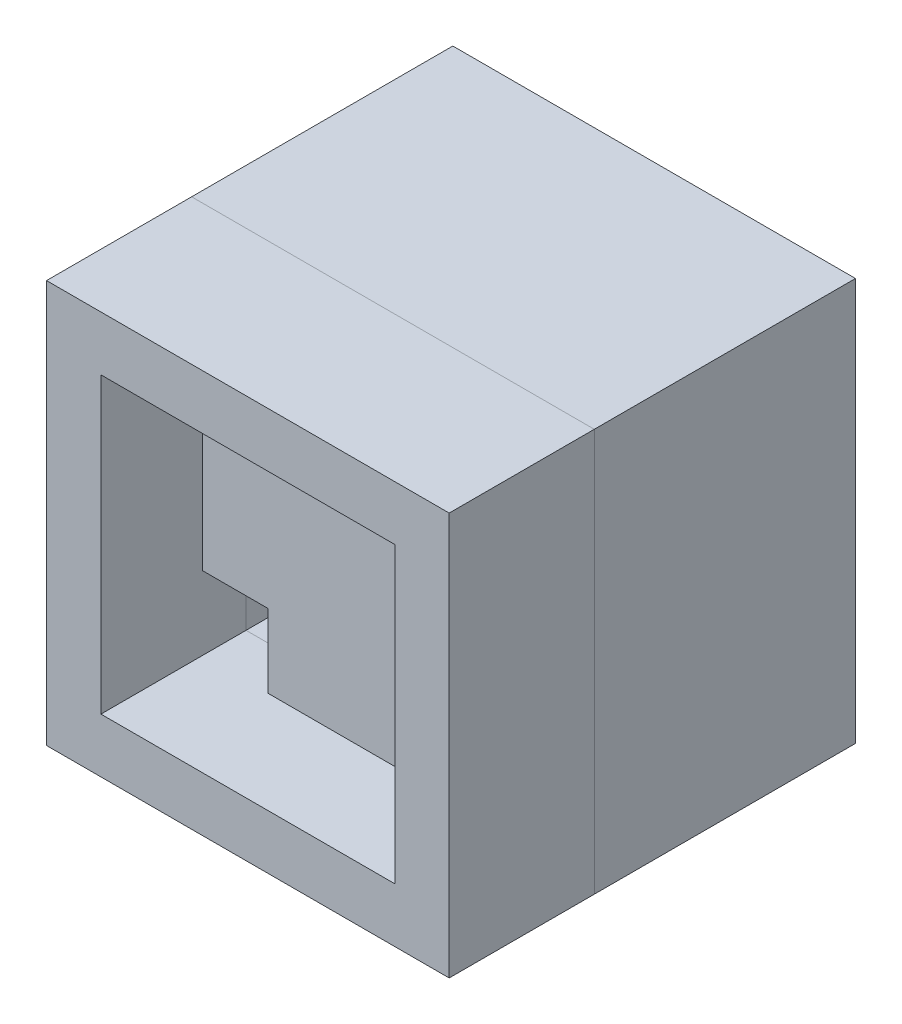
ISO-10303-21;
HEADER;
FILE_DESCRIPTION(('STEP AP214'),'2;1');
FILE_NAME('part.step','',(''),(''),'','','');
FILE_SCHEMA(('AUTOMOTIVE_DESIGN { 1 0 10303 214 1 1 1 1 }'));
ENDSEC;
DATA;
#1=APPLICATION_CONTEXT('core data for automotive mechanical design processes');
#2=APPLICATION_PROTOCOL_DEFINITION('international standard','automotive_design',2000,#1);
#3=PRODUCT_CONTEXT('',#1,'mechanical');
#4=PRODUCT('Part','Part','',(#3));
#5=PRODUCT_RELATED_PRODUCT_CATEGORY('part','',(#4));
#6=PRODUCT_DEFINITION_FORMATION('','',#4);
#7=PRODUCT_DEFINITION_CONTEXT('part definition',#1,'design');
#8=PRODUCT_DEFINITION('design','',#6,#7);
#9=PRODUCT_DEFINITION_SHAPE('','',#8);
#10=(LENGTH_UNIT() NAMED_UNIT(*) SI_UNIT(.MILLI.,.METRE.));
#11=(NAMED_UNIT(*) PLANE_ANGLE_UNIT() SI_UNIT($,.RADIAN.));
#12=(NAMED_UNIT(*) SI_UNIT($,.STERADIAN.) SOLID_ANGLE_UNIT());
#13=UNCERTAINTY_MEASURE_WITH_UNIT(LENGTH_MEASURE(1.E-05),#10,'distance_accuracy_value','');
#14=(GEOMETRIC_REPRESENTATION_CONTEXT(3) GLOBAL_UNCERTAINTY_ASSIGNED_CONTEXT((#13)) GLOBAL_UNIT_ASSIGNED_CONTEXT((#10,
#11,#12)) REPRESENTATION_CONTEXT('',''));
#15=CARTESIAN_POINT('',(0.,0.,0.));
#16=DIRECTION('',(0.,0.,1.));
#17=DIRECTION('',(1.,0.,0.));
#18=AXIS2_PLACEMENT_3D('',#15,#16,#17);
#19=CARTESIAN_POINT('',(7.79999999999714,9.6,7.2));
#20=DIRECTION('',(0.,0.,-1.));
#21=DIRECTION('',(-1.,0.,0.));
#22=AXIS2_PLACEMENT_3D('',#19,#20,#21);
#23=PLANE('',#22);
#24=DIRECTION('',(0.,-1.,0.));
#25=VECTOR('',#24,1.);
#26=CARTESIAN_POINT('',(3.30000000002428,-291588.345,7.2));
#27=LINE('',#26,#25);
#28=CARTESIAN_POINT('',(3.30000000002428,9.59999999997763,7.2));
#29=VERTEX_POINT('',#28);
#30=CARTESIAN_POINT('',(3.30000000002428,7.57499999997435,7.2));
#31=VERTEX_POINT('',#30);
#32=EDGE_CURVE('E300',#29,#31,#27,.T.);
#33=ORIENTED_EDGE('',*,*,#32,.F.);
#34=DIRECTION('',(-1.,0.,0.));
#35=VECTOR('',#34,1.);
#36=CARTESIAN_POINT('',(0.,9.6,7.2));
#37=LINE('',#36,#35);
#38=CARTESIAN_POINT('',(1.5,9.6,7.2));
#39=VERTEX_POINT('',#38);
#40=EDGE_CURVE('E305',#29,#39,#37,.T.);
#41=ORIENTED_EDGE('',*,*,#40,.T.);
#42=DIRECTION('',(0.,-1.,0.));
#43=VECTOR('',#42,1.);
#44=CARTESIAN_POINT('',(1.5,0.,7.2));
#45=LINE('',#44,#43);
#46=CARTESIAN_POINT('',(1.5,7.57499999997435,7.2));
#47=VERTEX_POINT('',#46);
#48=EDGE_CURVE('E448',#39,#47,#45,.T.);
#49=ORIENTED_EDGE('',*,*,#48,.T.);
#50=DIRECTION('',(-1.,0.,0.));
#51=VECTOR('',#50,1.);
#52=CARTESIAN_POINT('',(-399994.45,7.57499999997435,7.2));
#53=LINE('',#52,#51);
#54=EDGE_CURVE('E307',#31,#47,#53,.T.);
#55=ORIENTED_EDGE('',*,*,#54,.F.);
#56=EDGE_LOOP('',(#33,#41,#49,#55));
#57=FACE_BOUND('',#56,.T.);
#58=DIRECTION('',(0.,-1.,0.));
#59=VECTOR('',#58,1.);
#60=CARTESIAN_POINT('',(9.6,0.,7.2));
#61=LINE('',#60,#59);
#62=CARTESIAN_POINT('',(9.6,3.52500000002465,7.2));
#63=VERTEX_POINT('',#62);
#64=CARTESIAN_POINT('',(9.6,1.5,7.2));
#65=VERTEX_POINT('',#64);
#66=EDGE_CURVE('E439',#63,#65,#61,.T.);
#67=ORIENTED_EDGE('',*,*,#66,.F.);
#68=DIRECTION('',(1.,0.,0.));
#69=VECTOR('',#68,1.);
#70=CARTESIAN_POINT('',(-399994.45,3.52500000002465,7.2));
#71=LINE('',#70,#69);
#72=CARTESIAN_POINT('',(7.79999999997472,3.52500000002465,7.2));
#73=VERTEX_POINT('',#72);
#74=EDGE_CURVE('E413',#73,#63,#71,.T.);
#75=ORIENTED_EDGE('',*,*,#74,.F.);
#76=DIRECTION('',(0.,1.,0.));
#77=VECTOR('',#76,1.);
#78=CARTESIAN_POINT('',(7.80000000020209,-291588.345,7.2));
#79=LINE('',#78,#77);
#80=CARTESIAN_POINT('',(7.7999999999523,1.50000000002137,7.2));
#81=VERTEX_POINT('',#80);
#82=EDGE_CURVE('E418',#81,#73,#79,.T.);
#83=ORIENTED_EDGE('',*,*,#82,.F.);
#84=DIRECTION('',(-1.,0.,0.));
#85=VECTOR('',#84,1.);
#86=CARTESIAN_POINT('',(0.,1.5,7.2));
#87=LINE('',#86,#85);
#88=EDGE_CURVE('E446',#65,#81,#87,.T.);
#89=ORIENTED_EDGE('',*,*,#88,.F.);
#90=EDGE_LOOP('',(#67,#75,#83,#89));
#91=FACE_BOUND('',#90,.T.);
#92=CARTESIAN_POINT('',(3.30000000002428,1.5,7.2));
#93=VERTEX_POINT('',#92);
#94=CARTESIAN_POINT('',(1.5,1.5,7.2));
#95=VERTEX_POINT('',#94);
#96=EDGE_CURVE('E445',#93,#95,#87,.T.);
#97=ORIENTED_EDGE('',*,*,#96,.F.);
#98=DIRECTION('',(0.,1.,0.));
#99=VECTOR('',#98,1.);
#100=CARTESIAN_POINT('',(3.30000000002428,-291588.345,7.2));
#101=LINE('',#100,#99);
#102=CARTESIAN_POINT('',(3.30000000002428,3.52500000002465,7.2));
#103=VERTEX_POINT('',#102);
#104=EDGE_CURVE('E393',#93,#103,#101,.T.);
#105=ORIENTED_EDGE('',*,*,#104,.T.);
#106=DIRECTION('',(-1.,0.,0.));
#107=VECTOR('',#106,1.);
#108=CARTESIAN_POINT('',(-399994.45,3.52500000002465,7.2));
#109=LINE('',#108,#107);
#110=CARTESIAN_POINT('',(1.50000000002137,3.52500000002465,7.2));
#111=VERTEX_POINT('',#110);
#112=EDGE_CURVE('E384',#103,#111,#109,.T.);
#113=ORIENTED_EDGE('',*,*,#112,.T.);
#114=EDGE_CURVE('E449',#111,#95,#45,.T.);
#115=ORIENTED_EDGE('',*,*,#114,.T.);
#116=EDGE_LOOP('',(#97,#105,#113,#115));
#117=FACE_BOUND('',#116,.T.);
#118=CARTESIAN_POINT('',(9.6,9.6,7.2));
#119=VERTEX_POINT('',#118);
#120=CARTESIAN_POINT('',(7.79999999999714,9.6,7.2));
#121=VERTEX_POINT('',#120);
#122=EDGE_CURVE('E328',#119,#121,#37,.T.);
#123=ORIENTED_EDGE('',*,*,#122,.T.);
#124=DIRECTION('',(0.,1.,0.));
#125=VECTOR('',#124,1.);
#126=CARTESIAN_POINT('',(7.79999999974734,-291588.345,7.2));
#127=LINE('',#126,#125);
#128=CARTESIAN_POINT('',(7.79999999999714,7.57499999997435,7.2));
#129=VERTEX_POINT('',#128);
#130=EDGE_CURVE('E432',#129,#121,#127,.T.);
#131=ORIENTED_EDGE('',*,*,#130,.F.);
#132=DIRECTION('',(-1.,0.,0.));
#133=VECTOR('',#132,1.);
#134=CARTESIAN_POINT('',(-399994.45,7.57499999997435,7.2));
#135=LINE('',#134,#133);
#136=CARTESIAN_POINT('',(9.59999999997763,7.57499999997435,7.2));
#137=VERTEX_POINT('',#136);
#138=EDGE_CURVE('E428',#137,#129,#135,.T.);
#139=ORIENTED_EDGE('',*,*,#138,.F.);
#140=EDGE_CURVE('E437',#119,#137,#61,.T.);
#141=ORIENTED_EDGE('',*,*,#140,.F.);
#142=EDGE_LOOP('',(#123,#131,#139,#141));
#143=FACE_BOUND('',#142,.T.);
#144=DIRECTION('',(0.,-1.,0.));
#145=VECTOR('',#144,1.);
#146=CARTESIAN_POINT('',(0.,0.,7.2));
#147=LINE('',#146,#145);
#148=CARTESIAN_POINT('',(0.,11.1,7.2));
#149=VERTEX_POINT('',#148);
#150=CARTESIAN_POINT('',(0.,0.,7.2));
#151=VERTEX_POINT('',#150);
#152=EDGE_CURVE('E442',#149,#151,#147,.T.);
#153=ORIENTED_EDGE('',*,*,#152,.F.);
#154=DIRECTION('',(-1.,0.,0.));
#155=VECTOR('',#154,1.);
#156=CARTESIAN_POINT('',(0.,11.1,7.2));
#157=LINE('',#156,#155);
#158=CARTESIAN_POINT('',(11.1,11.1,7.2));
#159=VERTEX_POINT('',#158);
#160=EDGE_CURVE('E440',#159,#149,#157,.T.);
#161=ORIENTED_EDGE('',*,*,#160,.F.);
#162=DIRECTION('',(0.,-1.,0.));
#163=VECTOR('',#162,1.);
#164=CARTESIAN_POINT('',(11.1,0.,7.2));
#165=LINE('',#164,#163);
#166=CARTESIAN_POINT('',(11.1,0.,7.2));
#167=VERTEX_POINT('',#166);
#168=EDGE_CURVE('E331',#159,#167,#165,.T.);
#169=ORIENTED_EDGE('',*,*,#168,.T.);
#170=DIRECTION('',(-1.,0.,0.));
#171=VECTOR('',#170,1.);
#172=CARTESIAN_POINT('',(0.,0.,7.2));
#173=LINE('',#172,#171);
#174=EDGE_CURVE('E451',#167,#151,#173,.T.);
#175=ORIENTED_EDGE('',*,*,#174,.T.);
#176=EDGE_LOOP('',(#153,#161,#169,#175));
#177=FACE_BOUND('',#176,.T.);
#178=ADVANCED_FACE('F164',(#57,#91,#117,#143,#177),#23,.T.);
#179=CARTESIAN_POINT('',(0.,0.,1.2));
#180=DIRECTION('',(0.,1.,0.));
#181=DIRECTION('',(0.,0.,1.));
#182=AXIS2_PLACEMENT_3D('',#179,#180,#181);
#183=PLANE('',#182);
#184=ORIENTED_EDGE('',*,*,#174,.F.);
#185=DIRECTION('',(0.,0.,-1.));
#186=VECTOR('',#185,1.);
#187=CARTESIAN_POINT('',(11.1,0.,1.2));
#188=LINE('',#187,#186);
#189=CARTESIAN_POINT('',(11.1,0.,11.2));
#190=VERTEX_POINT('',#189);
#191=EDGE_CURVE('E337',#190,#167,#188,.T.);
#192=ORIENTED_EDGE('',*,*,#191,.F.);
#193=DIRECTION('',(1.,0.,0.));
#194=VECTOR('',#193,1.);
#195=CARTESIAN_POINT('',(0.,0.,11.2));
#196=LINE('',#195,#194);
#197=CARTESIAN_POINT('',(0.,0.,11.2));
#198=VERTEX_POINT('',#197);
#199=EDGE_CURVE('E346',#198,#190,#196,.T.);
#200=ORIENTED_EDGE('',*,*,#199,.F.);
#201=DIRECTION('',(0.,0.,-1.));
#202=VECTOR('',#201,1.);
#203=CARTESIAN_POINT('',(0.,0.,1.2));
#204=LINE('',#203,#202);
#205=EDGE_CURVE('E335',#198,#151,#204,.T.);
#206=ORIENTED_EDGE('',*,*,#205,.T.);
#207=EDGE_LOOP('',(#184,#192,#200,#206));
#208=FACE_BOUND('',#207,.T.);
#209=ADVANCED_FACE('F522',(#208),#183,.F.);
#210=CARTESIAN_POINT('',(0.,0.,11.2));
#211=DIRECTION('',(0.,0.,-1.));
#212=DIRECTION('',(-1.,0.,0.));
#213=AXIS2_PLACEMENT_3D('',#210,#211,#212);
#214=PLANE('',#213);
#215=DIRECTION('',(0.,1.,0.));
#216=VECTOR('',#215,1.);
#217=CARTESIAN_POINT('',(1.5,0.,11.2));
#218=LINE('',#217,#216);
#219=CARTESIAN_POINT('',(1.5,1.5,11.2));
#220=VERTEX_POINT('',#219);
#221=CARTESIAN_POINT('',(1.5,9.6,11.2));
#222=VERTEX_POINT('',#221);
#223=EDGE_CURVE('E356',#220,#222,#218,.T.);
#224=ORIENTED_EDGE('',*,*,#223,.T.);
#225=DIRECTION('',(1.,0.,0.));
#226=VECTOR('',#225,1.);
#227=CARTESIAN_POINT('',(0.,9.6,11.2));
#228=LINE('',#227,#226);
#229=CARTESIAN_POINT('',(9.6,9.6,11.2));
#230=VERTEX_POINT('',#229);
#231=EDGE_CURVE('E372',#222,#230,#228,.T.);
#232=ORIENTED_EDGE('',*,*,#231,.T.);
#233=DIRECTION('',(0.,1.,0.));
#234=VECTOR('',#233,1.);
#235=CARTESIAN_POINT('',(9.6,0.,11.2));
#236=LINE('',#235,#234);
#237=CARTESIAN_POINT('',(9.6,1.5,11.2));
#238=VERTEX_POINT('',#237);
#239=EDGE_CURVE('E366',#238,#230,#236,.T.);
#240=ORIENTED_EDGE('',*,*,#239,.F.);
#241=DIRECTION('',(1.,0.,0.));
#242=VECTOR('',#241,1.);
#243=CARTESIAN_POINT('',(0.,1.5,11.2));
#244=LINE('',#243,#242);
#245=EDGE_CURVE('E360',#220,#238,#244,.T.);
#246=ORIENTED_EDGE('',*,*,#245,.F.);
#247=EDGE_LOOP('',(#224,#232,#240,#246));
#248=FACE_BOUND('',#247,.T.);
#249=DIRECTION('',(0.,1.,0.));
#250=VECTOR('',#249,1.);
#251=CARTESIAN_POINT('',(0.,0.,11.2));
#252=LINE('',#251,#250);
#253=CARTESIAN_POINT('',(0.,11.1,11.2));
#254=VERTEX_POINT('',#253);
#255=EDGE_CURVE('E349',#198,#254,#252,.T.);
#256=ORIENTED_EDGE('',*,*,#255,.F.);
#257=ORIENTED_EDGE('',*,*,#199,.T.);
#258=DIRECTION('',(0.,1.,0.));
#259=VECTOR('',#258,1.);
#260=CARTESIAN_POINT('',(11.1,0.,11.2));
#261=LINE('',#260,#259);
#262=CARTESIAN_POINT('',(11.1,11.1,11.2));
#263=VERTEX_POINT('',#262);
#264=EDGE_CURVE('E469',#190,#263,#261,.T.);
#265=ORIENTED_EDGE('',*,*,#264,.T.);
#266=DIRECTION('',(1.,0.,0.));
#267=VECTOR('',#266,1.);
#268=CARTESIAN_POINT('',(0.,11.1,11.2));
#269=LINE('',#268,#267);
#270=EDGE_CURVE('E465',#254,#263,#269,.T.);
#271=ORIENTED_EDGE('',*,*,#270,.F.);
#272=EDGE_LOOP('',(#256,#257,#265,#271));
#273=FACE_BOUND('',#272,.T.);
#274=ADVANCED_FACE('F503',(#248,#273),#214,.F.);
#275=CARTESIAN_POINT('',(-399994.45,3.52500000002465,7.2));
#276=DIRECTION('',(0.,1.,0.));
#277=DIRECTION('',(0.,0.,1.));
#278=AXIS2_PLACEMENT_3D('',#275,#276,#277);
#279=PLANE('',#278);
#280=DIRECTION('',(-1.,0.,0.));
#281=VECTOR('',#280,1.);
#282=CARTESIAN_POINT('',(-399994.45,3.52500000002465,8.4));
#283=LINE('',#282,#281);
#284=CARTESIAN_POINT('',(3.30000000002428,3.52500000002465,8.4));
#285=VERTEX_POINT('',#284);
#286=CARTESIAN_POINT('',(1.50000000002137,3.52500000002465,8.4));
#287=VERTEX_POINT('',#286);
#288=EDGE_CURVE('E389',#285,#287,#283,.T.);
#289=ORIENTED_EDGE('',*,*,#288,.T.);
#290=DIRECTION('',(0.,0.,1.));
#291=VECTOR('',#290,1.);
#292=CARTESIAN_POINT('',(1.50000000002137,3.52500000002465,7.2));
#293=LINE('',#292,#291);
#294=EDGE_CURVE('E380',#111,#287,#293,.T.);
#295=ORIENTED_EDGE('',*,*,#294,.F.);
#296=ORIENTED_EDGE('',*,*,#112,.F.);
#297=DIRECTION('',(0.,0.,1.));
#298=VECTOR('',#297,1.);
#299=CARTESIAN_POINT('',(3.30000000002428,3.52500000002465,7.2));
#300=LINE('',#299,#298);
#301=EDGE_CURVE('E385',#103,#285,#300,.T.);
#302=ORIENTED_EDGE('',*,*,#301,.T.);
#303=EDGE_LOOP('',(#289,#295,#296,#302));
#304=FACE_BOUND('',#303,.T.);
#305=ADVANCED_FACE('F530',(#304),#279,.F.);
#306=CARTESIAN_POINT('',(1.5,0.,11.2));
#307=DIRECTION('',(-1.,0.,0.));
#308=DIRECTION('',(0.,-1.,0.));
#309=AXIS2_PLACEMENT_3D('',#306,#307,#308);
#310=PLANE('',#309);
#311=ORIENTED_EDGE('',*,*,#48,.F.);
#312=DIRECTION('',(0.,0.,-1.));
#313=VECTOR('',#312,1.);
#314=CARTESIAN_POINT('',(1.5,9.6,11.2));
#315=LINE('',#314,#313);
#316=EDGE_CURVE('E326',#222,#39,#315,.T.);
#317=ORIENTED_EDGE('',*,*,#316,.F.);
#318=ORIENTED_EDGE('',*,*,#223,.F.);
#319=DIRECTION('',(0.,0.,-1.));
#320=VECTOR('',#319,1.);
#321=CARTESIAN_POINT('',(1.5,1.5,11.2));
#322=LINE('',#321,#320);
#323=EDGE_CURVE('E348',#220,#95,#322,.T.);
#324=ORIENTED_EDGE('',*,*,#323,.T.);
#325=ORIENTED_EDGE('',*,*,#114,.F.);
#326=ORIENTED_EDGE('',*,*,#294,.T.);
#327=DIRECTION('',(0.,-1.,0.));
#328=VECTOR('',#327,1.);
#329=CARTESIAN_POINT('',(1.5,0.,8.4));
#330=LINE('',#329,#328);
#331=CARTESIAN_POINT('',(1.49999999999575,7.57499999997435,8.4));
#332=VERTEX_POINT('',#331);
#333=EDGE_CURVE('E376',#332,#287,#330,.T.);
#334=ORIENTED_EDGE('',*,*,#333,.F.);
#335=DIRECTION('',(0.,0.,1.));
#336=VECTOR('',#335,1.);
#337=CARTESIAN_POINT('',(1.49999999999575,7.57499999997435,7.2));
#338=LINE('',#337,#336);
#339=EDGE_CURVE('E321',#47,#332,#338,.T.);
#340=ORIENTED_EDGE('',*,*,#339,.F.);
#341=EDGE_LOOP('',(#311,#317,#318,#324,#325,#326,#334,#340));
#342=FACE_BOUND('',#341,.T.);
#343=ADVANCED_FACE('F502',(#342),#310,.F.);
#344=CARTESIAN_POINT('',(3.30000000002428,-291588.345,7.2));
#345=DIRECTION('',(-1.,0.,0.));
#346=DIRECTION('',(0.,0.,1.));
#347=AXIS2_PLACEMENT_3D('',#344,#345,#346);
#348=PLANE('',#347);
#349=DIRECTION('',(0.,-1.,0.));
#350=VECTOR('',#349,1.);
#351=CARTESIAN_POINT('',(3.30000000002428,-291588.345,8.4));
#352=LINE('',#351,#350);
#353=CARTESIAN_POINT('',(3.30000000002428,9.59999999997763,8.4));
#354=VERTEX_POINT('',#353);
#355=CARTESIAN_POINT('',(3.30000000002428,7.57499999997435,8.4));
#356=VERTEX_POINT('',#355);
#357=EDGE_CURVE('E318',#354,#356,#352,.T.);
#358=ORIENTED_EDGE('',*,*,#357,.F.);
#359=DIRECTION('',(0.,0.,1.));
#360=VECTOR('',#359,1.);
#361=CARTESIAN_POINT('',(3.30000000002428,9.59999999997763,7.2));
#362=LINE('',#361,#360);
#363=EDGE_CURVE('E315',#29,#354,#362,.T.);
#364=ORIENTED_EDGE('',*,*,#363,.F.);
#365=ORIENTED_EDGE('',*,*,#32,.T.);
#366=DIRECTION('',(0.,0.,1.));
#367=VECTOR('',#366,1.);
#368=CARTESIAN_POINT('',(3.30000000002428,7.57499999997435,7.2));
#369=LINE('',#368,#367);
#370=EDGE_CURVE('E396',#31,#356,#369,.T.);
#371=ORIENTED_EDGE('',*,*,#370,.T.);
#372=EDGE_LOOP('',(#358,#364,#365,#371));
#373=FACE_BOUND('',#372,.T.);
#374=ADVANCED_FACE('F316',(#373),#348,.T.);
#375=CARTESIAN_POINT('',(0.,1.5,11.2));
#376=DIRECTION('',(0.,1.,0.));
#377=DIRECTION('',(-1.,0.,0.));
#378=AXIS2_PLACEMENT_3D('',#375,#376,#377);
#379=PLANE('',#378);
#380=DIRECTION('',(0.,0.,-1.));
#381=VECTOR('',#380,1.);
#382=CARTESIAN_POINT('',(9.6,1.5,11.2));
#383=LINE('',#382,#381);
#384=EDGE_CURVE('E351',#238,#65,#383,.T.);
#385=ORIENTED_EDGE('',*,*,#384,.T.);
#386=ORIENTED_EDGE('',*,*,#88,.T.);
#387=DIRECTION('',(0.,0.,1.));
#388=VECTOR('',#387,1.);
#389=CARTESIAN_POINT('',(7.7999999999523,1.50000000002137,7.2));
#390=LINE('',#389,#388);
#391=CARTESIAN_POINT('',(7.7999999999523,1.5,8.4));
#392=VERTEX_POINT('',#391);
#393=EDGE_CURVE('E405',#81,#392,#390,.T.);
#394=ORIENTED_EDGE('',*,*,#393,.T.);
#395=DIRECTION('',(-1.,0.,0.));
#396=VECTOR('',#395,1.);
#397=CARTESIAN_POINT('',(0.,1.5,8.4));
#398=LINE('',#397,#396);
#399=CARTESIAN_POINT('',(3.30000000002428,1.5,8.4));
#400=VERTEX_POINT('',#399);
#401=EDGE_CURVE('E378',#392,#400,#398,.T.);
#402=ORIENTED_EDGE('',*,*,#401,.T.);
#403=DIRECTION('',(0.,0.,1.));
#404=VECTOR('',#403,1.);
#405=CARTESIAN_POINT('',(3.30000000002428,1.50000000002137,7.2));
#406=LINE('',#405,#404);
#407=EDGE_CURVE('E381',#93,#400,#406,.T.);
#408=ORIENTED_EDGE('',*,*,#407,.F.);
#409=ORIENTED_EDGE('',*,*,#96,.T.);
#410=ORIENTED_EDGE('',*,*,#323,.F.);
#411=ORIENTED_EDGE('',*,*,#245,.T.);
#412=EDGE_LOOP('',(#385,#386,#394,#402,#408,#409,#410,#411));
#413=FACE_BOUND('',#412,.T.);
#414=ADVANCED_FACE('F482',(#413),#379,.T.);
#415=CARTESIAN_POINT('',(7.80000000020209,-291588.345,7.2));
#416=DIRECTION('',(1.,0.,0.));
#417=DIRECTION('',(0.,1.,0.));
#418=AXIS2_PLACEMENT_3D('',#415,#416,#417);
#419=PLANE('',#418);
#420=DIRECTION('',(0.,1.,0.));
#421=VECTOR('',#420,1.);
#422=CARTESIAN_POINT('',(7.80000000020209,-291588.345,8.4));
#423=LINE('',#422,#421);
#424=CARTESIAN_POINT('',(7.79999999997472,3.52500000002465,8.4));
#425=VERTEX_POINT('',#424);
#426=EDGE_CURVE('E417',#392,#425,#423,.T.);
#427=ORIENTED_EDGE('',*,*,#426,.F.);
#428=ORIENTED_EDGE('',*,*,#393,.F.);
#429=ORIENTED_EDGE('',*,*,#82,.T.);
#430=DIRECTION('',(0.,0.,1.));
#431=VECTOR('',#430,1.);
#432=CARTESIAN_POINT('',(7.79999999997472,3.52500000002465,7.2));
#433=LINE('',#432,#431);
#434=EDGE_CURVE('E408',#73,#425,#433,.T.);
#435=ORIENTED_EDGE('',*,*,#434,.T.);
#436=EDGE_LOOP('',(#427,#428,#429,#435));
#437=FACE_BOUND('',#436,.T.);
#438=ADVANCED_FACE('F486',(#437),#419,.T.);
#439=CARTESIAN_POINT('',(9.6,0.,11.2));
#440=DIRECTION('',(-1.,0.,0.));
#441=DIRECTION('',(0.,0.,1.));
#442=AXIS2_PLACEMENT_3D('',#439,#440,#441);
#443=PLANE('',#442);
#444=DIRECTION('',(0.,0.,-1.));
#445=VECTOR('',#444,1.);
#446=CARTESIAN_POINT('',(9.6,9.6,11.2));
#447=LINE('',#446,#445);
#448=EDGE_CURVE('E168',#230,#119,#447,.T.);
#449=ORIENTED_EDGE('',*,*,#448,.T.);
#450=ORIENTED_EDGE('',*,*,#140,.T.);
#451=DIRECTION('',(0.,0.,1.));
#452=VECTOR('',#451,1.);
#453=CARTESIAN_POINT('',(9.59999999997763,7.57499999997435,7.2));
#454=LINE('',#453,#452);
#455=CARTESIAN_POINT('',(9.6,7.57499999997435,8.4));
#456=VERTEX_POINT('',#455);
#457=EDGE_CURVE('E421',#137,#456,#454,.T.);
#458=ORIENTED_EDGE('',*,*,#457,.T.);
#459=DIRECTION('',(0.,-1.,0.));
#460=VECTOR('',#459,1.);
#461=CARTESIAN_POINT('',(9.6,0.,8.4));
#462=LINE('',#461,#460);
#463=CARTESIAN_POINT('',(9.6,3.52500000002465,8.4));
#464=VERTEX_POINT('',#463);
#465=EDGE_CURVE('E338',#456,#464,#462,.T.);
#466=ORIENTED_EDGE('',*,*,#465,.T.);
#467=DIRECTION('',(0.,0.,1.));
#468=VECTOR('',#467,1.);
#469=CARTESIAN_POINT('',(9.59999999997763,3.52500000002465,7.2));
#470=LINE('',#469,#468);
#471=EDGE_CURVE('E410',#63,#464,#470,.T.);
#472=ORIENTED_EDGE('',*,*,#471,.F.);
#473=ORIENTED_EDGE('',*,*,#66,.T.);
#474=ORIENTED_EDGE('',*,*,#384,.F.);
#475=ORIENTED_EDGE('',*,*,#239,.T.);
#476=EDGE_LOOP('',(#449,#450,#458,#466,#472,#473,#474,#475));
#477=FACE_BOUND('',#476,.T.);
#478=ADVANCED_FACE('F477',(#477),#443,.T.);
#479=CARTESIAN_POINT('',(0.,9.6,11.2));
#480=DIRECTION('',(0.,1.,0.));
#481=DIRECTION('',(0.,0.,1.));
#482=AXIS2_PLACEMENT_3D('',#479,#480,#481);
#483=PLANE('',#482);
#484=ORIENTED_EDGE('',*,*,#122,.F.);
#485=ORIENTED_EDGE('',*,*,#448,.F.);
#486=ORIENTED_EDGE('',*,*,#231,.F.);
#487=ORIENTED_EDGE('',*,*,#316,.T.);
#488=ORIENTED_EDGE('',*,*,#40,.F.);
#489=ORIENTED_EDGE('',*,*,#363,.T.);
#490=DIRECTION('',(-1.,0.,0.));
#491=VECTOR('',#490,1.);
#492=CARTESIAN_POINT('',(0.,9.6,8.4));
#493=LINE('',#492,#491);
#494=CARTESIAN_POINT('',(7.79999999999714,9.59999999997763,8.4));
#495=VERTEX_POINT('',#494);
#496=EDGE_CURVE('E374',#495,#354,#493,.T.);
#497=ORIENTED_EDGE('',*,*,#496,.F.);
#498=DIRECTION('',(0.,0.,1.));
#499=VECTOR('',#498,1.);
#500=CARTESIAN_POINT('',(7.79999999999714,9.59999999997763,7.2));
#501=LINE('',#500,#499);
#502=EDGE_CURVE('E426',#121,#495,#501,.T.);
#503=ORIENTED_EDGE('',*,*,#502,.F.);
#504=EDGE_LOOP('',(#484,#485,#486,#487,#488,#489,#497,#503));
#505=FACE_BOUND('',#504,.T.);
#506=ADVANCED_FACE('F324',(#505),#483,.F.);
#507=CARTESIAN_POINT('',(-399994.45,7.57499999997435,7.2));
#508=DIRECTION('',(0.,1.,0.));
#509=DIRECTION('',(0.,0.,1.));
#510=AXIS2_PLACEMENT_3D('',#507,#508,#509);
#511=PLANE('',#510);
#512=DIRECTION('',(-1.,0.,0.));
#513=VECTOR('',#512,1.);
#514=CARTESIAN_POINT('',(-399994.45,7.57499999997435,8.4));
#515=LINE('',#514,#513);
#516=CARTESIAN_POINT('',(7.79999999997472,7.57499999997435,8.4));
#517=VERTEX_POINT('',#516);
#518=EDGE_CURVE('E174',#456,#517,#515,.T.);
#519=ORIENTED_EDGE('',*,*,#518,.F.);
#520=ORIENTED_EDGE('',*,*,#457,.F.);
#521=ORIENTED_EDGE('',*,*,#138,.T.);
#522=DIRECTION('',(0.,0.,1.));
#523=VECTOR('',#522,1.);
#524=CARTESIAN_POINT('',(7.79999999997472,7.57499999997435,7.2));
#525=LINE('',#524,#523);
#526=EDGE_CURVE('E181',#129,#517,#525,.T.);
#527=ORIENTED_EDGE('',*,*,#526,.T.);
#528=EDGE_LOOP('',(#519,#520,#521,#527));
#529=FACE_BOUND('',#528,.T.);
#530=ADVANCED_FACE('F507',(#529),#511,.T.);
#531=CARTESIAN_POINT('',(0.,0.,8.4));
#532=DIRECTION('',(0.,0.,-1.));
#533=DIRECTION('',(-1.,0.,0.));
#534=AXIS2_PLACEMENT_3D('',#531,#532,#533);
#535=PLANE('',#534);
#536=DIRECTION('',(0.,1.,0.));
#537=VECTOR('',#536,1.);
#538=CARTESIAN_POINT('',(7.79999999974734,-291588.345,8.4));
#539=LINE('',#538,#537);
#540=EDGE_CURVE('E14',#517,#495,#539,.T.);
#541=ORIENTED_EDGE('',*,*,#540,.T.);
#542=ORIENTED_EDGE('',*,*,#496,.T.);
#543=ORIENTED_EDGE('',*,*,#357,.T.);
#544=DIRECTION('',(-1.,0.,0.));
#545=VECTOR('',#544,1.);
#546=CARTESIAN_POINT('',(-399994.45,7.57499999997435,8.4));
#547=LINE('',#546,#545);
#548=EDGE_CURVE('E311',#356,#332,#547,.T.);
#549=ORIENTED_EDGE('',*,*,#548,.T.);
#550=ORIENTED_EDGE('',*,*,#333,.T.);
#551=ORIENTED_EDGE('',*,*,#288,.F.);
#552=DIRECTION('',(0.,1.,0.));
#553=VECTOR('',#552,1.);
#554=CARTESIAN_POINT('',(3.30000000002428,-291588.345,8.4));
#555=LINE('',#554,#553);
#556=EDGE_CURVE('E392',#400,#285,#555,.T.);
#557=ORIENTED_EDGE('',*,*,#556,.F.);
#558=ORIENTED_EDGE('',*,*,#401,.F.);
#559=ORIENTED_EDGE('',*,*,#426,.T.);
#560=DIRECTION('',(1.,0.,0.));
#561=VECTOR('',#560,1.);
#562=CARTESIAN_POINT('',(-399994.45,3.52500000002465,8.4));
#563=LINE('',#562,#561);
#564=EDGE_CURVE('E414',#425,#464,#563,.T.);
#565=ORIENTED_EDGE('',*,*,#564,.T.);
#566=ORIENTED_EDGE('',*,*,#465,.F.);
#567=ORIENTED_EDGE('',*,*,#518,.T.);
#568=EDGE_LOOP('',(#541,#542,#543,#549,#550,#551,#557,#558,#559,#565,#566,#567));
#569=FACE_BOUND('',#568,.T.);
#570=ADVANCED_FACE('F489',(#569),#535,.F.);
#571=CARTESIAN_POINT('',(7.79999999974734,-291588.345,7.2));
#572=DIRECTION('',(1.,0.,0.));
#573=DIRECTION('',(0.,1.,0.));
#574=AXIS2_PLACEMENT_3D('',#571,#572,#573);
#575=PLANE('',#574);
#576=ORIENTED_EDGE('',*,*,#540,.F.);
#577=ORIENTED_EDGE('',*,*,#526,.F.);
#578=ORIENTED_EDGE('',*,*,#130,.T.);
#579=ORIENTED_EDGE('',*,*,#502,.T.);
#580=EDGE_LOOP('',(#576,#577,#578,#579));
#581=FACE_BOUND('',#580,.T.);
#582=ADVANCED_FACE('F509',(#581),#575,.T.);
#583=CARTESIAN_POINT('',(-399994.45,3.52500000002465,7.2));
#584=DIRECTION('',(0.,-1.,0.));
#585=DIRECTION('',(0.,0.,-1.));
#586=AXIS2_PLACEMENT_3D('',#583,#584,#585);
#587=PLANE('',#586);
#588=ORIENTED_EDGE('',*,*,#564,.F.);
#589=ORIENTED_EDGE('',*,*,#434,.F.);
#590=ORIENTED_EDGE('',*,*,#74,.T.);
#591=ORIENTED_EDGE('',*,*,#471,.T.);
#592=EDGE_LOOP('',(#588,#589,#590,#591));
#593=FACE_BOUND('',#592,.T.);
#594=ADVANCED_FACE('F511',(#593),#587,.T.);
#595=CARTESIAN_POINT('',(-399994.45,7.57499999997435,7.2));
#596=DIRECTION('',(0.,1.,0.));
#597=DIRECTION('',(0.,0.,1.));
#598=AXIS2_PLACEMENT_3D('',#595,#596,#597);
#599=PLANE('',#598);
#600=ORIENTED_EDGE('',*,*,#548,.F.);
#601=ORIENTED_EDGE('',*,*,#370,.F.);
#602=ORIENTED_EDGE('',*,*,#54,.T.);
#603=ORIENTED_EDGE('',*,*,#339,.T.);
#604=EDGE_LOOP('',(#600,#601,#602,#603));
#605=FACE_BOUND('',#604,.T.);
#606=ADVANCED_FACE('F517',(#605),#599,.T.);
#607=CARTESIAN_POINT('',(3.30000000002428,-291588.345,7.2));
#608=DIRECTION('',(1.,0.,0.));
#609=DIRECTION('',(0.,0.,-1.));
#610=AXIS2_PLACEMENT_3D('',#607,#608,#609);
#611=PLANE('',#610);
#612=ORIENTED_EDGE('',*,*,#556,.T.);
#613=ORIENTED_EDGE('',*,*,#301,.F.);
#614=ORIENTED_EDGE('',*,*,#104,.F.);
#615=ORIENTED_EDGE('',*,*,#407,.T.);
#616=EDGE_LOOP('',(#612,#613,#614,#615));
#617=FACE_BOUND('',#616,.T.);
#618=ADVANCED_FACE('F495',(#617),#611,.F.);
#619=CARTESIAN_POINT('',(0.,0.,1.2));
#620=DIRECTION('',(-1.,0.,0.));
#621=DIRECTION('',(0.,0.,1.));
#622=AXIS2_PLACEMENT_3D('',#619,#620,#621);
#623=PLANE('',#622);
#624=DIRECTION('',(0.,0.,-1.));
#625=VECTOR('',#624,1.);
#626=CARTESIAN_POINT('',(0.,11.1,1.2));
#627=LINE('',#626,#625);
#628=EDGE_CURVE('E343',#254,#149,#627,.T.);
#629=ORIENTED_EDGE('',*,*,#628,.T.);
#630=ORIENTED_EDGE('',*,*,#152,.T.);
#631=ORIENTED_EDGE('',*,*,#205,.F.);
#632=ORIENTED_EDGE('',*,*,#255,.T.);
#633=EDGE_LOOP('',(#629,#630,#631,#632));
#634=FACE_BOUND('',#633,.T.);
#635=ADVANCED_FACE('F534',(#634),#623,.T.);
#636=CARTESIAN_POINT('',(11.1,0.,1.2));
#637=DIRECTION('',(-1.,0.,0.));
#638=DIRECTION('',(0.,0.,1.));
#639=AXIS2_PLACEMENT_3D('',#636,#637,#638);
#640=PLANE('',#639);
#641=ORIENTED_EDGE('',*,*,#168,.F.);
#642=DIRECTION('',(0.,0.,-1.));
#643=VECTOR('',#642,1.);
#644=CARTESIAN_POINT('',(11.1,11.1,1.2));
#645=LINE('',#644,#643);
#646=EDGE_CURVE('E340',#263,#159,#645,.T.);
#647=ORIENTED_EDGE('',*,*,#646,.F.);
#648=ORIENTED_EDGE('',*,*,#264,.F.);
#649=ORIENTED_EDGE('',*,*,#191,.T.);
#650=EDGE_LOOP('',(#641,#647,#648,#649));
#651=FACE_BOUND('',#650,.T.);
#652=ADVANCED_FACE('F459',(#651),#640,.F.);
#653=CARTESIAN_POINT('',(0.,11.1,1.2));
#654=DIRECTION('',(0.,1.,0.));
#655=DIRECTION('',(0.,0.,1.));
#656=AXIS2_PLACEMENT_3D('',#653,#654,#655);
#657=PLANE('',#656);
#658=ORIENTED_EDGE('',*,*,#646,.T.);
#659=ORIENTED_EDGE('',*,*,#160,.T.);
#660=ORIENTED_EDGE('',*,*,#628,.F.);
#661=ORIENTED_EDGE('',*,*,#270,.T.);
#662=EDGE_LOOP('',(#658,#659,#660,#661));
#663=FACE_BOUND('',#662,.T.);
#664=ADVANCED_FACE('F166',(#663),#657,.T.);
#665=CLOSED_SHELL('',(#178,#209,#274,#305,#343,#374,#414,#438,#478,#506,#530,#570,#582,#594,
#606,#618,#635,#652,#664));
#666=MANIFOLD_SOLID_BREP('B2',#665);
#667=CARTESIAN_POINT('',(0.,1.5,11.2));
#668=DIRECTION('',(0.,1.,0.));
#669=DIRECTION('',(-1.,0.,0.));
#670=AXIS2_PLACEMENT_3D('',#667,#668,#669);
#671=PLANE('',#670);
#672=DIRECTION('',(1.,0.,0.));
#673=VECTOR('',#672,1.);
#674=CARTESIAN_POINT('',(0.,1.5,1.2));
#675=LINE('',#674,#673);
#676=CARTESIAN_POINT('',(7.575,1.5,1.2));
#677=VERTEX_POINT('',#676);
#678=CARTESIAN_POINT('',(9.6,1.5,1.2));
#679=VERTEX_POINT('',#678);
#680=EDGE_CURVE('E834',#677,#679,#675,.T.);
#681=ORIENTED_EDGE('',*,*,#680,.F.);
#682=DIRECTION('',(0.,0.,-1.));
#683=VECTOR('',#682,1.);
#684=CARTESIAN_POINT('',(7.575,1.5,5.2));
#685=LINE('',#684,#683);
#686=CARTESIAN_POINT('',(7.575,1.5,5.2));
#687=VERTEX_POINT('',#686);
#688=EDGE_CURVE('E716',#687,#677,#685,.T.);
#689=ORIENTED_EDGE('',*,*,#688,.F.);
#690=DIRECTION('',(-1.,0.,0.));
#691=VECTOR('',#690,1.);
#692=CARTESIAN_POINT('',(3.525,1.5,5.2));
#693=LINE('',#692,#691);
#694=CARTESIAN_POINT('',(3.525,1.5,5.2));
#695=VERTEX_POINT('',#694);
#696=EDGE_CURVE('E796',#687,#695,#693,.T.);
#697=ORIENTED_EDGE('',*,*,#696,.T.);
#698=DIRECTION('',(0.,0.,-1.));
#699=VECTOR('',#698,1.);
#700=CARTESIAN_POINT('',(3.525,1.5,5.2));
#701=LINE('',#700,#699);
#702=CARTESIAN_POINT('',(3.525,1.5,1.2));
#703=VERTEX_POINT('',#702);
#704=EDGE_CURVE('E820',#695,#703,#701,.T.);
#705=ORIENTED_EDGE('',*,*,#704,.T.);
#706=CARTESIAN_POINT('',(1.5,1.5,1.2));
#707=VERTEX_POINT('',#706);
#708=EDGE_CURVE('E835',#707,#703,#675,.T.);
#709=ORIENTED_EDGE('',*,*,#708,.F.);
#710=DIRECTION('',(0.,0.,-1.));
#711=VECTOR('',#710,1.);
#712=CARTESIAN_POINT('',(1.5,1.5,11.2));
#713=LINE('',#712,#711);
#714=CARTESIAN_POINT('',(1.5,1.5,7.2));
#715=VERTEX_POINT('',#714);
#716=EDGE_CURVE('E845',#715,#707,#713,.T.);
#717=ORIENTED_EDGE('',*,*,#716,.F.);
#718=DIRECTION('',(-1.,0.,0.));
#719=VECTOR('',#718,1.);
#720=CARTESIAN_POINT('',(0.,1.5,7.2));
#721=LINE('',#720,#719);
#722=CARTESIAN_POINT('',(9.6,1.5,7.2));
#723=VERTEX_POINT('',#722);
#724=EDGE_CURVE('E871',#723,#715,#721,.T.);
#725=ORIENTED_EDGE('',*,*,#724,.F.);
#726=DIRECTION('',(0.,0.,-1.));
#727=VECTOR('',#726,1.);
#728=CARTESIAN_POINT('',(9.6,1.5,11.2));
#729=LINE('',#728,#727);
#730=EDGE_CURVE('E847',#723,#679,#729,.T.);
#731=ORIENTED_EDGE('',*,*,#730,.T.);
#732=EDGE_LOOP('',(#681,#689,#697,#705,#709,#717,#725,#731));
#733=FACE_BOUND('',#732,.T.);
#734=ADVANCED_FACE('F699',(#733),#671,.T.);
#735=CARTESIAN_POINT('',(7.79999999999714,9.6,7.2));
#736=DIRECTION('',(0.,0.,-1.));
#737=DIRECTION('',(-1.,0.,0.));
#738=AXIS2_PLACEMENT_3D('',#735,#736,#737);
#739=PLANE('',#738);
#740=DIRECTION('',(0.,-1.,0.));
#741=VECTOR('',#740,1.);
#742=CARTESIAN_POINT('',(0.,0.,7.2));
#743=LINE('',#742,#741);
#744=CARTESIAN_POINT('',(0.,11.1,7.2));
#745=VERTEX_POINT('',#744);
#746=CARTESIAN_POINT('',(0.,0.,7.2));
#747=VERTEX_POINT('',#746);
#748=EDGE_CURVE('E703',#745,#747,#743,.T.);
#749=ORIENTED_EDGE('',*,*,#748,.T.);
#750=DIRECTION('',(-1.,0.,0.));
#751=VECTOR('',#750,1.);
#752=CARTESIAN_POINT('',(0.,0.,7.2));
#753=LINE('',#752,#751);
#754=CARTESIAN_POINT('',(11.1,0.,7.2));
#755=VERTEX_POINT('',#754);
#756=EDGE_CURVE('E873',#755,#747,#753,.T.);
#757=ORIENTED_EDGE('',*,*,#756,.F.);
#758=DIRECTION('',(0.,-1.,0.));
#759=VECTOR('',#758,1.);
#760=CARTESIAN_POINT('',(11.1,0.,7.2));
#761=LINE('',#760,#759);
#762=CARTESIAN_POINT('',(11.1,11.1,7.2));
#763=VERTEX_POINT('',#762);
#764=EDGE_CURVE('E865',#763,#755,#761,.T.);
#765=ORIENTED_EDGE('',*,*,#764,.F.);
#766=DIRECTION('',(-1.,0.,0.));
#767=VECTOR('',#766,1.);
#768=CARTESIAN_POINT('',(0.,11.1,7.2));
#769=LINE('',#768,#767);
#770=EDGE_CURVE('E708',#763,#745,#769,.T.);
#771=ORIENTED_EDGE('',*,*,#770,.T.);
#772=EDGE_LOOP('',(#749,#757,#765,#771));
#773=FACE_BOUND('',#772,.T.);
#774=DIRECTION('',(0.,-1.,0.));
#775=VECTOR('',#774,1.);
#776=CARTESIAN_POINT('',(1.5,0.,7.2));
#777=LINE('',#776,#775);
#778=CARTESIAN_POINT('',(1.5,9.6,7.2));
#779=VERTEX_POINT('',#778);
#780=EDGE_CURVE('E805',#779,#715,#777,.T.);
#781=ORIENTED_EDGE('',*,*,#780,.F.);
#782=DIRECTION('',(-1.,0.,0.));
#783=VECTOR('',#782,1.);
#784=CARTESIAN_POINT('',(0.,9.6,7.2));
#785=LINE('',#784,#783);
#786=CARTESIAN_POINT('',(9.6,9.6,7.2));
#787=VERTEX_POINT('',#786);
#788=EDGE_CURVE('E826',#787,#779,#785,.T.);
#789=ORIENTED_EDGE('',*,*,#788,.F.);
#790=DIRECTION('',(0.,-1.,0.));
#791=VECTOR('',#790,1.);
#792=CARTESIAN_POINT('',(9.6,0.,7.2));
#793=LINE('',#792,#791);
#794=EDGE_CURVE('E162',#787,#723,#793,.T.);
#795=ORIENTED_EDGE('',*,*,#794,.T.);
#796=ORIENTED_EDGE('',*,*,#724,.T.);
#797=EDGE_LOOP('',(#781,#789,#795,#796));
#798=FACE_BOUND('',#797,.T.);
#799=ADVANCED_FACE('F701',(#773,#798),#739,.F.);
#800=CARTESIAN_POINT('',(9.6,0.,11.2));
#801=DIRECTION('',(-1.,0.,0.));
#802=DIRECTION('',(0.,0.,1.));
#803=AXIS2_PLACEMENT_3D('',#800,#801,#802);
#804=PLANE('',#803);
#805=ORIENTED_EDGE('',*,*,#794,.F.);
#806=DIRECTION('',(0.,0.,-1.));
#807=VECTOR('',#806,1.);
#808=CARTESIAN_POINT('',(9.6,9.6,11.2));
#809=LINE('',#808,#807);
#810=CARTESIAN_POINT('',(9.6,9.6,1.2));
#811=VERTEX_POINT('',#810);
#812=EDGE_CURVE('E841',#787,#811,#809,.T.);
#813=ORIENTED_EDGE('',*,*,#812,.T.);
#814=DIRECTION('',(0.,1.,0.));
#815=VECTOR('',#814,1.);
#816=CARTESIAN_POINT('',(9.6,0.,1.2));
#817=LINE('',#816,#815);
#818=EDGE_CURVE('E831',#679,#811,#817,.T.);
#819=ORIENTED_EDGE('',*,*,#818,.F.);
#820=ORIENTED_EDGE('',*,*,#730,.F.);
#821=EDGE_LOOP('',(#805,#813,#819,#820));
#822=FACE_BOUND('',#821,.T.);
#823=ADVANCED_FACE('F911',(#822),#804,.T.);
#824=CARTESIAN_POINT('',(0.,0.,1.2));
#825=DIRECTION('',(0.,0.,-1.));
#826=DIRECTION('',(-1.,0.,0.));
#827=AXIS2_PLACEMENT_3D('',#824,#825,#826);
#828=PLANE('',#827);
#829=DIRECTION('',(1.,0.,0.));
#830=VECTOR('',#829,1.);
#831=CARTESIAN_POINT('',(0.,9.6,1.2));
#832=LINE('',#831,#830);
#833=CARTESIAN_POINT('',(1.5,9.6,1.2));
#834=VERTEX_POINT('',#833);
#835=EDGE_CURVE('E828',#834,#811,#832,.T.);
#836=ORIENTED_EDGE('',*,*,#835,.F.);
#837=DIRECTION('',(0.,1.,0.));
#838=VECTOR('',#837,1.);
#839=CARTESIAN_POINT('',(1.5,0.,1.2));
#840=LINE('',#839,#838);
#841=EDGE_CURVE('E838',#707,#834,#840,.T.);
#842=ORIENTED_EDGE('',*,*,#841,.F.);
#843=ORIENTED_EDGE('',*,*,#708,.T.);
#844=DIRECTION('',(0.,-1.,0.));
#845=VECTOR('',#844,1.);
#846=CARTESIAN_POINT('',(3.525,0.,1.2));
#847=LINE('',#846,#845);
#848=CARTESIAN_POINT('',(3.525,0.,1.2));
#849=VERTEX_POINT('',#848);
#850=EDGE_CURVE('E809',#703,#849,#847,.T.);
#851=ORIENTED_EDGE('',*,*,#850,.T.);
#852=DIRECTION('',(1.,0.,0.));
#853=VECTOR('',#852,1.);
#854=CARTESIAN_POINT('',(3.525,0.,1.2));
#855=LINE('',#854,#853);
#856=CARTESIAN_POINT('',(7.575,0.,1.2));
#857=VERTEX_POINT('',#856);
#858=EDGE_CURVE('E816',#849,#857,#855,.T.);
#859=ORIENTED_EDGE('',*,*,#858,.T.);
#860=DIRECTION('',(0.,1.,0.));
#861=VECTOR('',#860,1.);
#862=CARTESIAN_POINT('',(7.575,0.,1.2));
#863=LINE('',#862,#861);
#864=EDGE_CURVE('E801',#857,#677,#863,.T.);
#865=ORIENTED_EDGE('',*,*,#864,.T.);
#866=ORIENTED_EDGE('',*,*,#680,.T.);
#867=ORIENTED_EDGE('',*,*,#818,.T.);
#868=EDGE_LOOP('',(#836,#842,#843,#851,#859,#865,#866,#867));
#869=FACE_BOUND('',#868,.T.);
#870=ADVANCED_FACE('F919',(#869),#828,.F.);
#871=CARTESIAN_POINT('',(0.,9.6,11.2));
#872=DIRECTION('',(0.,1.,0.));
#873=DIRECTION('',(0.,0.,1.));
#874=AXIS2_PLACEMENT_3D('',#871,#872,#873);
#875=PLANE('',#874);
#876=ORIENTED_EDGE('',*,*,#812,.F.);
#877=ORIENTED_EDGE('',*,*,#788,.T.);
#878=DIRECTION('',(0.,0.,-1.));
#879=VECTOR('',#878,1.);
#880=CARTESIAN_POINT('',(1.5,9.6,11.2));
#881=LINE('',#880,#879);
#882=EDGE_CURVE('E842',#779,#834,#881,.T.);
#883=ORIENTED_EDGE('',*,*,#882,.T.);
#884=ORIENTED_EDGE('',*,*,#835,.T.);
#885=EDGE_LOOP('',(#876,#877,#883,#884));
#886=FACE_BOUND('',#885,.T.);
#887=ADVANCED_FACE('F921',(#886),#875,.F.);
#888=CARTESIAN_POINT('',(1.5,0.,11.2));
#889=DIRECTION('',(-1.,0.,0.));
#890=DIRECTION('',(0.,-1.,0.));
#891=AXIS2_PLACEMENT_3D('',#888,#889,#890);
#892=PLANE('',#891);
#893=ORIENTED_EDGE('',*,*,#882,.F.);
#894=ORIENTED_EDGE('',*,*,#780,.T.);
#895=ORIENTED_EDGE('',*,*,#716,.T.);
#896=ORIENTED_EDGE('',*,*,#841,.T.);
#897=EDGE_LOOP('',(#893,#894,#895,#896));
#898=FACE_BOUND('',#897,.T.);
#899=ADVANCED_FACE('F915',(#898),#892,.F.);
#900=CARTESIAN_POINT('',(0.,0.,1.2));
#901=DIRECTION('',(-1.,0.,0.));
#902=DIRECTION('',(0.,0.,1.));
#903=AXIS2_PLACEMENT_3D('',#900,#901,#902);
#904=PLANE('',#903);
#905=ORIENTED_EDGE('',*,*,#748,.F.);
#906=DIRECTION('',(0.,0.,-1.));
#907=VECTOR('',#906,1.);
#908=CARTESIAN_POINT('',(0.,11.1,1.2));
#909=LINE('',#908,#907);
#910=CARTESIAN_POINT('',(0.,11.1,0.));
#911=VERTEX_POINT('',#910);
#912=EDGE_CURVE('E862',#745,#911,#909,.T.);
#913=ORIENTED_EDGE('',*,*,#912,.T.);
#914=DIRECTION('',(0.,1.,0.));
#915=VECTOR('',#914,1.);
#916=CARTESIAN_POINT('',(0.,0.,0.));
#917=LINE('',#916,#915);
#918=CARTESIAN_POINT('',(0.,0.,0.));
#919=VERTEX_POINT('',#918);
#920=EDGE_CURVE('E844',#919,#911,#917,.T.);
#921=ORIENTED_EDGE('',*,*,#920,.F.);
#922=DIRECTION('',(0.,0.,-1.));
#923=VECTOR('',#922,1.);
#924=CARTESIAN_POINT('',(0.,0.,1.2));
#925=LINE('',#924,#923);
#926=EDGE_CURVE('E863',#747,#919,#925,.T.);
#927=ORIENTED_EDGE('',*,*,#926,.F.);
#928=EDGE_LOOP('',(#905,#913,#921,#927));
#929=FACE_BOUND('',#928,.T.);
#930=ADVANCED_FACE('F887',(#929),#904,.T.);
#931=CARTESIAN_POINT('',(0.,0.,1.2));
#932=DIRECTION('',(0.,1.,0.));
#933=DIRECTION('',(0.,0.,1.));
#934=AXIS2_PLACEMENT_3D('',#931,#932,#933);
#935=PLANE('',#934);
#936=DIRECTION('',(0.,0.,-1.));
#937=VECTOR('',#936,1.);
#938=CARTESIAN_POINT('',(3.525,0.,5.2));
#939=LINE('',#938,#937);
#940=CARTESIAN_POINT('',(3.525,0.,5.2));
#941=VERTEX_POINT('',#940);
#942=EDGE_CURVE('E724',#941,#849,#939,.T.);
#943=ORIENTED_EDGE('',*,*,#942,.F.);
#944=DIRECTION('',(1.,0.,0.));
#945=VECTOR('',#944,1.);
#946=CARTESIAN_POINT('',(3.525,0.,5.2));
#947=LINE('',#946,#945);
#948=CARTESIAN_POINT('',(7.575,0.,5.2));
#949=VERTEX_POINT('',#948);
#950=EDGE_CURVE('E794',#941,#949,#947,.T.);
#951=ORIENTED_EDGE('',*,*,#950,.T.);
#952=DIRECTION('',(0.,0.,-1.));
#953=VECTOR('',#952,1.);
#954=CARTESIAN_POINT('',(7.575,0.,5.2));
#955=LINE('',#954,#953);
#956=EDGE_CURVE('E799',#949,#857,#955,.T.);
#957=ORIENTED_EDGE('',*,*,#956,.T.);
#958=ORIENTED_EDGE('',*,*,#858,.F.);
#959=EDGE_LOOP('',(#943,#951,#957,#958));
#960=FACE_BOUND('',#959,.T.);
#961=DIRECTION('',(0.,0.,-1.));
#962=VECTOR('',#961,1.);
#963=CARTESIAN_POINT('',(11.1,0.,1.2));
#964=LINE('',#963,#962);
#965=CARTESIAN_POINT('',(11.1,0.,0.));
#966=VERTEX_POINT('',#965);
#967=EDGE_CURVE('E866',#755,#966,#964,.T.);
#968=ORIENTED_EDGE('',*,*,#967,.F.);
#969=ORIENTED_EDGE('',*,*,#756,.T.);
#970=ORIENTED_EDGE('',*,*,#926,.T.);
#971=DIRECTION('',(1.,0.,0.));
#972=VECTOR('',#971,1.);
#973=CARTESIAN_POINT('',(0.,0.,0.));
#974=LINE('',#973,#972);
#975=EDGE_CURVE('E859',#919,#966,#974,.T.);
#976=ORIENTED_EDGE('',*,*,#975,.T.);
#977=EDGE_LOOP('',(#968,#969,#970,#976));
#978=FACE_BOUND('',#977,.T.);
#979=ADVANCED_FACE('F807',(#960,#978),#935,.F.);
#980=CARTESIAN_POINT('',(11.1,0.,1.2));
#981=DIRECTION('',(-1.,0.,0.));
#982=DIRECTION('',(0.,0.,1.));
#983=AXIS2_PLACEMENT_3D('',#980,#981,#982);
#984=PLANE('',#983);
#985=DIRECTION('',(0.,0.,-1.));
#986=VECTOR('',#985,1.);
#987=CARTESIAN_POINT('',(11.1,11.1,1.2));
#988=LINE('',#987,#986);
#989=CARTESIAN_POINT('',(11.1,11.1,0.));
#990=VERTEX_POINT('',#989);
#991=EDGE_CURVE('E868',#763,#990,#988,.T.);
#992=ORIENTED_EDGE('',*,*,#991,.F.);
#993=ORIENTED_EDGE('',*,*,#764,.T.);
#994=ORIENTED_EDGE('',*,*,#967,.T.);
#995=DIRECTION('',(0.,1.,0.));
#996=VECTOR('',#995,1.);
#997=CARTESIAN_POINT('',(11.1,0.,0.));
#998=LINE('',#997,#996);
#999=EDGE_CURVE('E856',#966,#990,#998,.T.);
#1000=ORIENTED_EDGE('',*,*,#999,.T.);
#1001=EDGE_LOOP('',(#992,#993,#994,#1000));
#1002=FACE_BOUND('',#1001,.T.);
#1003=ADVANCED_FACE('F894',(#1002),#984,.F.);
#1004=CARTESIAN_POINT('',(0.,11.1,1.2));
#1005=DIRECTION('',(0.,1.,0.));
#1006=DIRECTION('',(0.,0.,1.));
#1007=AXIS2_PLACEMENT_3D('',#1004,#1005,#1006);
#1008=PLANE('',#1007);
#1009=ORIENTED_EDGE('',*,*,#770,.F.);
#1010=ORIENTED_EDGE('',*,*,#991,.T.);
#1011=DIRECTION('',(1.,0.,0.));
#1012=VECTOR('',#1011,1.);
#1013=CARTESIAN_POINT('',(0.,11.1,0.));
#1014=LINE('',#1013,#1012);
#1015=EDGE_CURVE('E853',#911,#990,#1014,.T.);
#1016=ORIENTED_EDGE('',*,*,#1015,.F.);
#1017=ORIENTED_EDGE('',*,*,#912,.F.);
#1018=EDGE_LOOP('',(#1009,#1010,#1016,#1017));
#1019=FACE_BOUND('',#1018,.T.);
#1020=ADVANCED_FACE('F896',(#1019),#1008,.T.);
#1021=CARTESIAN_POINT('',(0.,0.,0.));
#1022=DIRECTION('',(0.,0.,-1.));
#1023=DIRECTION('',(-1.,0.,0.));
#1024=AXIS2_PLACEMENT_3D('',#1021,#1022,#1023);
#1025=PLANE('',#1024);
#1026=ORIENTED_EDGE('',*,*,#920,.T.);
#1027=ORIENTED_EDGE('',*,*,#1015,.T.);
#1028=ORIENTED_EDGE('',*,*,#999,.F.);
#1029=ORIENTED_EDGE('',*,*,#975,.F.);
#1030=EDGE_LOOP('',(#1026,#1027,#1028,#1029));
#1031=FACE_BOUND('',#1030,.T.);
#1032=ADVANCED_FACE('F890',(#1031),#1025,.T.);
#1033=CARTESIAN_POINT('',(7.575,0.,5.2));
#1034=DIRECTION('',(-1.,0.,0.));
#1035=DIRECTION('',(0.,0.,1.));
#1036=AXIS2_PLACEMENT_3D('',#1033,#1034,#1035);
#1037=PLANE('',#1036);
#1038=ORIENTED_EDGE('',*,*,#864,.F.);
#1039=ORIENTED_EDGE('',*,*,#956,.F.);
#1040=DIRECTION('',(0.,1.,0.));
#1041=VECTOR('',#1040,1.);
#1042=CARTESIAN_POINT('',(7.575,0.,5.2));
#1043=LINE('',#1042,#1041);
#1044=EDGE_CURVE('E789',#949,#687,#1043,.T.);
#1045=ORIENTED_EDGE('',*,*,#1044,.T.);
#1046=ORIENTED_EDGE('',*,*,#688,.T.);
#1047=EDGE_LOOP('',(#1038,#1039,#1045,#1046));
#1048=FACE_BOUND('',#1047,.T.);
#1049=ADVANCED_FACE('F800',(#1048),#1037,.T.);
#1050=CARTESIAN_POINT('',(3.525,0.,5.2));
#1051=DIRECTION('',(1.,0.,0.));
#1052=DIRECTION('',(0.,0.,-1.));
#1053=AXIS2_PLACEMENT_3D('',#1050,#1051,#1052);
#1054=PLANE('',#1053);
#1055=ORIENTED_EDGE('',*,*,#850,.F.);
#1056=ORIENTED_EDGE('',*,*,#704,.F.);
#1057=DIRECTION('',(0.,-1.,0.));
#1058=VECTOR('',#1057,1.);
#1059=CARTESIAN_POINT('',(3.525,0.,5.2));
#1060=LINE('',#1059,#1058);
#1061=EDGE_CURVE('E814',#695,#941,#1060,.T.);
#1062=ORIENTED_EDGE('',*,*,#1061,.T.);
#1063=ORIENTED_EDGE('',*,*,#942,.T.);
#1064=EDGE_LOOP('',(#1055,#1056,#1062,#1063));
#1065=FACE_BOUND('',#1064,.T.);
#1066=ADVANCED_FACE('F949',(#1065),#1054,.T.);
#1067=CARTESIAN_POINT('',(0.,0.,5.2));
#1068=DIRECTION('',(0.,0.,1.));
#1069=DIRECTION('',(1.,0.,0.));
#1070=AXIS2_PLACEMENT_3D('',#1067,#1068,#1069);
#1071=PLANE('',#1070);
#1072=ORIENTED_EDGE('',*,*,#950,.F.);
#1073=ORIENTED_EDGE('',*,*,#1061,.F.);
#1074=ORIENTED_EDGE('',*,*,#696,.F.);
#1075=ORIENTED_EDGE('',*,*,#1044,.F.);
#1076=EDGE_LOOP('',(#1072,#1073,#1074,#1075));
#1077=FACE_BOUND('',#1076,.T.);
#1078=ADVANCED_FACE('F791',(#1077),#1071,.F.);
#1079=CLOSED_SHELL('',(#734,#799,#823,#870,#887,#899,#930,#979,#1003,#1020,#1032,#1049,#1066,#1078));
#1080=MANIFOLD_SOLID_BREP('B8',#1079);
#1081=ADVANCED_BREP_SHAPE_REPRESENTATION('',(#18,#666,#1080),#14);
#1082=SHAPE_DEFINITION_REPRESENTATION(#9,#1081);
ENDSEC;
END-ISO-10303-21;
